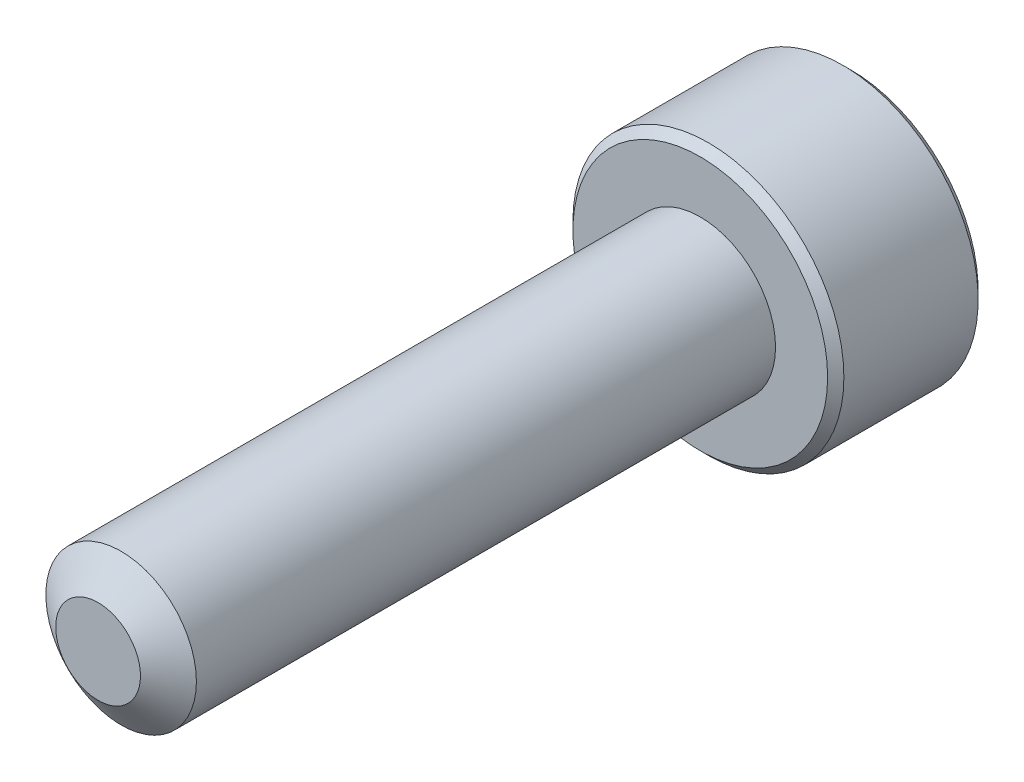
ISO-10303-21;
HEADER;
FILE_DESCRIPTION(('STEP AP214'),'2;1');
FILE_NAME('part.step','',(''),(''),'','','');
FILE_SCHEMA(('AUTOMOTIVE_DESIGN { 1 0 10303 214 1 1 1 1 }'));
ENDSEC;
DATA;
#1=APPLICATION_CONTEXT('core data for automotive mechanical design processes');
#2=APPLICATION_PROTOCOL_DEFINITION('international standard','automotive_design',2000,#1);
#3=PRODUCT_CONTEXT('',#1,'mechanical');
#4=PRODUCT('Part','Part','',(#3));
#5=PRODUCT_RELATED_PRODUCT_CATEGORY('part','',(#4));
#6=PRODUCT_DEFINITION_FORMATION('','',#4);
#7=PRODUCT_DEFINITION_CONTEXT('part definition',#1,'design');
#8=PRODUCT_DEFINITION('design','',#6,#7);
#9=PRODUCT_DEFINITION_SHAPE('','',#8);
#10=(LENGTH_UNIT() NAMED_UNIT(*) SI_UNIT(.MILLI.,.METRE.));
#11=(NAMED_UNIT(*) PLANE_ANGLE_UNIT() SI_UNIT($,.RADIAN.));
#12=(NAMED_UNIT(*) SI_UNIT($,.STERADIAN.) SOLID_ANGLE_UNIT());
#13=UNCERTAINTY_MEASURE_WITH_UNIT(LENGTH_MEASURE(1.E-05),#10,'distance_accuracy_value','');
#14=(GEOMETRIC_REPRESENTATION_CONTEXT(3) GLOBAL_UNCERTAINTY_ASSIGNED_CONTEXT((#13)) GLOBAL_UNIT_ASSIGNED_CONTEXT((#10,
#11,#12)) REPRESENTATION_CONTEXT('',''));
#15=CARTESIAN_POINT('',(0.,0.,0.));
#16=DIRECTION('',(0.,0.,1.));
#17=DIRECTION('',(1.,0.,0.));
#18=AXIS2_PLACEMENT_3D('',#15,#16,#17);
#19=CARTESIAN_POINT('',(-1.,0.577350269189626,-11.));
#20=DIRECTION('',(-0.5,0.866025403784439,0.));
#21=DIRECTION('',(0.,0.,1.));
#22=AXIS2_PLACEMENT_3D('',#19,#20,#21);
#23=PLANE('',#22);
#24=DIRECTION('',(0.,0.,-1.));
#25=VECTOR('',#24,1.);
#26=CARTESIAN_POINT('',(-1.,0.577350269189626,-11.));
#27=LINE('',#26,#25);
#28=CARTESIAN_POINT('',(-1.,0.577350269189626,-11.));
#29=VERTEX_POINT('',#28);
#30=CARTESIAN_POINT('',(-1.,0.577350269189625,-12.5));
#31=VERTEX_POINT('',#30);
#32=EDGE_CURVE('E11',#29,#31,#27,.T.);
#33=ORIENTED_EDGE('',*,*,#32,.T.);
#34=CARTESIAN_POINT('',(-0.999999999999949,0.577350269189655,-12.5));
#35=CARTESIAN_POINT('',(-0.5,0.866025403784439,-12.2113248654052));
#36=CARTESIAN_POINT('',(0.,1.15470053837922,-12.5));
#37=(BOUNDED_CURVE() B_SPLINE_CURVE(2,(#34,#35,#36),.UNSPECIFIED.,.F.,
.F.) B_SPLINE_CURVE_WITH_KNOTS((3,3),(-0.3218671551163,-0.124274873543865),
.UNSPECIFIED.) CURVE() GEOMETRIC_REPRESENTATION_ITEM() RATIONAL_B_SPLINE_CURVE((1.46410161513778,
1.69059892324148,1.46410161513778)) REPRESENTATION_ITEM(''));
#38=CARTESIAN_POINT('',(0.,1.15470053837925,-12.5));
#39=VERTEX_POINT('',#38);
#40=EDGE_CURVE('E184',#31,#39,#37,.T.);
#41=ORIENTED_EDGE('',*,*,#40,.T.);
#42=DIRECTION('',(0.,0.,-1.));
#43=VECTOR('',#42,1.);
#44=CARTESIAN_POINT('',(0.,1.15470053837925,-11.));
#45=LINE('',#44,#43);
#46=CARTESIAN_POINT('',(0.,1.15470053837925,-11.));
#47=VERTEX_POINT('',#46);
#48=EDGE_CURVE('E266',#47,#39,#45,.T.);
#49=ORIENTED_EDGE('',*,*,#48,.F.);
#50=DIRECTION('',(0.866025403784439,0.5,0.));
#51=VECTOR('',#50,1.);
#52=CARTESIAN_POINT('',(-1.,0.577350269189626,-11.));
#53=LINE('',#52,#51);
#54=EDGE_CURVE('E190',#29,#47,#53,.T.);
#55=ORIENTED_EDGE('',*,*,#54,.F.);
#56=EDGE_LOOP('',(#33,#41,#49,#55));
#57=FACE_BOUND('',#56,.T.);
#58=ADVANCED_FACE('F17',(#57),#23,.F.);
#59=CARTESIAN_POINT('',(-1.,-0.577350269189626,-11.));
#60=DIRECTION('',(-1.,0.,0.));
#61=DIRECTION('',(0.,0.,1.));
#62=AXIS2_PLACEMENT_3D('',#59,#60,#61);
#63=PLANE('',#62);
#64=DIRECTION('',(0.,0.,-1.));
#65=VECTOR('',#64,1.);
#66=CARTESIAN_POINT('',(-1.,-0.577350269189626,-11.));
#67=LINE('',#66,#65);
#68=CARTESIAN_POINT('',(-1.,-0.577350269189626,-11.));
#69=VERTEX_POINT('',#68);
#70=CARTESIAN_POINT('',(-1.,-0.577350269189626,-12.5));
#71=VERTEX_POINT('',#70);
#72=EDGE_CURVE('E28',#69,#71,#67,.T.);
#73=ORIENTED_EDGE('',*,*,#72,.T.);
#74=CARTESIAN_POINT('',(-1.,-0.577350269189569,-12.5));
#75=CARTESIAN_POINT('',(-1.,0.,-12.2113248654052));
#76=CARTESIAN_POINT('',(-1.,0.577350269189568,-12.5));
#77=(BOUNDED_CURVE() B_SPLINE_CURVE(2,(#74,#75,#76),.UNSPECIFIED.,.F.,
.F.) B_SPLINE_CURVE_WITH_KNOTS((3,3),(-0.3218671551163,-0.124274873543865),
.UNSPECIFIED.) CURVE() GEOMETRIC_REPRESENTATION_ITEM() RATIONAL_B_SPLINE_CURVE((1.46410161513778,
1.69059892324148,1.46410161513778)) REPRESENTATION_ITEM(''));
#78=EDGE_CURVE('E139',#71,#31,#77,.T.);
#79=ORIENTED_EDGE('',*,*,#78,.T.);
#80=ORIENTED_EDGE('',*,*,#32,.F.);
#81=DIRECTION('',(0.,1.,0.));
#82=VECTOR('',#81,1.);
#83=CARTESIAN_POINT('',(-1.,-0.577350269189626,-11.));
#84=LINE('',#83,#82);
#85=EDGE_CURVE('E524',#69,#29,#84,.T.);
#86=ORIENTED_EDGE('',*,*,#85,.F.);
#87=EDGE_LOOP('',(#73,#79,#80,#86));
#88=FACE_BOUND('',#87,.T.);
#89=ADVANCED_FACE('F301',(#88),#63,.F.);
#90=CARTESIAN_POINT('',(0.,-1.15470053837925,-11.));
#91=DIRECTION('',(-0.5,-0.866025403784439,0.));
#92=DIRECTION('',(-0.866025403784439,0.5,0.));
#93=AXIS2_PLACEMENT_3D('',#90,#91,#92);
#94=PLANE('',#93);
#95=DIRECTION('',(0.,0.,-1.));
#96=VECTOR('',#95,1.);
#97=CARTESIAN_POINT('',(0.,-1.15470053837925,-11.));
#98=LINE('',#97,#96);
#99=CARTESIAN_POINT('',(0.,-1.15470053837925,-11.));
#100=VERTEX_POINT('',#99);
#101=CARTESIAN_POINT('',(0.,-1.15470053837925,-12.5));
#102=VERTEX_POINT('',#101);
#103=EDGE_CURVE('E223',#100,#102,#98,.T.);
#104=ORIENTED_EDGE('',*,*,#103,.T.);
#105=CARTESIAN_POINT('',(0.,-1.15470053837922,-12.5));
#106=CARTESIAN_POINT('',(-0.499999999999999,-0.866025403784439,-12.2113248654052));
#107=CARTESIAN_POINT('',(-0.999999999999951,-0.577350269189654,-12.5));
#108=(BOUNDED_CURVE() B_SPLINE_CURVE(2,(#105,#106,#107),.UNSPECIFIED.,.F.,
.F.) B_SPLINE_CURVE_WITH_KNOTS((3,3),(-0.3218671551163,-0.124274873543865),
.UNSPECIFIED.) CURVE() GEOMETRIC_REPRESENTATION_ITEM() RATIONAL_B_SPLINE_CURVE((1.46410161513778,
1.69059892324148,1.46410161513778)) REPRESENTATION_ITEM(''));
#109=EDGE_CURVE('E191',#102,#71,#108,.T.);
#110=ORIENTED_EDGE('',*,*,#109,.T.);
#111=ORIENTED_EDGE('',*,*,#72,.F.);
#112=DIRECTION('',(-0.866025403784439,0.5,0.));
#113=VECTOR('',#112,1.);
#114=CARTESIAN_POINT('',(0.,-1.15470053837925,-11.));
#115=LINE('',#114,#113);
#116=EDGE_CURVE('E132',#100,#69,#115,.T.);
#117=ORIENTED_EDGE('',*,*,#116,.F.);
#118=EDGE_LOOP('',(#104,#110,#111,#117));
#119=FACE_BOUND('',#118,.T.);
#120=ADVANCED_FACE('F306',(#119),#94,.F.);
#121=CARTESIAN_POINT('',(1.,-0.577350269189626,-11.));
#122=DIRECTION('',(0.5,-0.866025403784439,0.));
#123=DIRECTION('',(0.,0.,-1.));
#124=AXIS2_PLACEMENT_3D('',#121,#122,#123);
#125=PLANE('',#124);
#126=DIRECTION('',(0.,0.,-1.));
#127=VECTOR('',#126,1.);
#128=CARTESIAN_POINT('',(1.,-0.577350269189626,-11.));
#129=LINE('',#128,#127);
#130=CARTESIAN_POINT('',(1.,-0.577350269189626,-11.));
#131=VERTEX_POINT('',#130);
#132=CARTESIAN_POINT('',(1.,-0.577350269189625,-12.5));
#133=VERTEX_POINT('',#132);
#134=EDGE_CURVE('E228',#131,#133,#129,.T.);
#135=ORIENTED_EDGE('',*,*,#134,.T.);
#136=CARTESIAN_POINT('',(0.999999999999949,-0.577350269189655,-12.5));
#137=CARTESIAN_POINT('',(0.5,-0.866025403784439,-12.2113248654052));
#138=CARTESIAN_POINT('',(0.,-1.15470053837922,-12.5));
#139=(BOUNDED_CURVE() B_SPLINE_CURVE(2,(#136,#137,#138),.UNSPECIFIED.,.F.,
.F.) B_SPLINE_CURVE_WITH_KNOTS((3,3),(-0.3218671551163,-0.124274873543865),
.UNSPECIFIED.) CURVE() GEOMETRIC_REPRESENTATION_ITEM() RATIONAL_B_SPLINE_CURVE((1.46410161513778,
1.69059892324148,1.46410161513778)) REPRESENTATION_ITEM(''));
#140=EDGE_CURVE('E170',#133,#102,#139,.T.);
#141=ORIENTED_EDGE('',*,*,#140,.T.);
#142=ORIENTED_EDGE('',*,*,#103,.F.);
#143=DIRECTION('',(-0.866025403784439,-0.5,0.));
#144=VECTOR('',#143,1.);
#145=CARTESIAN_POINT('',(1.,-0.577350269189626,-11.));
#146=LINE('',#145,#144);
#147=EDGE_CURVE('E157',#131,#100,#146,.T.);
#148=ORIENTED_EDGE('',*,*,#147,.F.);
#149=EDGE_LOOP('',(#135,#141,#142,#148));
#150=FACE_BOUND('',#149,.T.);
#151=ADVANCED_FACE('F358',(#150),#125,.F.);
#152=CARTESIAN_POINT('',(1.,0.577350269189626,-11.));
#153=DIRECTION('',(1.,0.,0.));
#154=DIRECTION('',(0.,1.,0.));
#155=AXIS2_PLACEMENT_3D('',#152,#153,#154);
#156=PLANE('',#155);
#157=DIRECTION('',(0.,0.,-1.));
#158=VECTOR('',#157,1.);
#159=CARTESIAN_POINT('',(1.,0.577350269189626,-11.));
#160=LINE('',#159,#158);
#161=CARTESIAN_POINT('',(1.,0.577350269189626,-11.));
#162=VERTEX_POINT('',#161);
#163=CARTESIAN_POINT('',(1.,0.577350269189626,-12.5));
#164=VERTEX_POINT('',#163);
#165=EDGE_CURVE('E21',#162,#164,#160,.T.);
#166=ORIENTED_EDGE('',*,*,#165,.T.);
#167=CARTESIAN_POINT('',(1.,0.57735026918957,-12.5));
#168=CARTESIAN_POINT('',(1.,0.,-12.2113248654052));
#169=CARTESIAN_POINT('',(1.,-0.577350269189567,-12.5));
#170=(BOUNDED_CURVE() B_SPLINE_CURVE(2,(#167,#168,#169),.UNSPECIFIED.,.F.,
.F.) B_SPLINE_CURVE_WITH_KNOTS((3,3),(-0.3218671551163,-0.124274873543866),
.UNSPECIFIED.) CURVE() GEOMETRIC_REPRESENTATION_ITEM() RATIONAL_B_SPLINE_CURVE((1.46410161513777,
1.69059892324148,1.46410161513777)) REPRESENTATION_ITEM(''));
#171=EDGE_CURVE('E164',#164,#133,#170,.T.);
#172=ORIENTED_EDGE('',*,*,#171,.T.);
#173=ORIENTED_EDGE('',*,*,#134,.F.);
#174=DIRECTION('',(0.,-1.,0.));
#175=VECTOR('',#174,1.);
#176=CARTESIAN_POINT('',(1.,0.577350269189626,-11.));
#177=LINE('',#176,#175);
#178=EDGE_CURVE('E161',#162,#131,#177,.T.);
#179=ORIENTED_EDGE('',*,*,#178,.F.);
#180=EDGE_LOOP('',(#166,#172,#173,#179));
#181=FACE_BOUND('',#180,.T.);
#182=ADVANCED_FACE('F366',(#181),#156,.F.);
#183=CARTESIAN_POINT('',(0.,1.15470053837925,-11.));
#184=DIRECTION('',(0.5,0.866025403784439,0.));
#185=DIRECTION('',(0.,0.,-1.));
#186=AXIS2_PLACEMENT_3D('',#183,#184,#185);
#187=PLANE('',#186);
#188=ORIENTED_EDGE('',*,*,#48,.T.);
#189=CARTESIAN_POINT('',(0.,1.15470053837923,-12.5));
#190=CARTESIAN_POINT('',(0.499999999999998,0.866025403784439,-12.2113248654052));
#191=CARTESIAN_POINT('',(0.999999999999949,0.577350269189655,-12.5));
#192=(BOUNDED_CURVE() B_SPLINE_CURVE(2,(#189,#190,#191),.UNSPECIFIED.,.F.,
.F.) B_SPLINE_CURVE_WITH_KNOTS((3,3),(-0.3218671551163,-0.124274873543865),
.UNSPECIFIED.) CURVE() GEOMETRIC_REPRESENTATION_ITEM() RATIONAL_B_SPLINE_CURVE((1.46410161513778,
1.69059892324148,1.46410161513778)) REPRESENTATION_ITEM(''));
#193=EDGE_CURVE('E171',#39,#164,#192,.T.);
#194=ORIENTED_EDGE('',*,*,#193,.T.);
#195=ORIENTED_EDGE('',*,*,#165,.F.);
#196=DIRECTION('',(0.866025403784439,-0.5,0.));
#197=VECTOR('',#196,1.);
#198=CARTESIAN_POINT('',(0.,1.15470053837925,-11.));
#199=LINE('',#198,#197);
#200=EDGE_CURVE('E221',#47,#162,#199,.T.);
#201=ORIENTED_EDGE('',*,*,#200,.F.);
#202=EDGE_LOOP('',(#188,#194,#195,#201));
#203=FACE_BOUND('',#202,.T.);
#204=ADVANCED_FACE('F263',(#203),#187,.F.);
#205=CARTESIAN_POINT('',(1.,1.73205080756888,-11.));
#206=DIRECTION('',(0.,0.,-1.));
#207=DIRECTION('',(0.,-1.,0.));
#208=AXIS2_PLACEMENT_3D('',#205,#206,#207);
#209=PLANE('',#208);
#210=ORIENTED_EDGE('',*,*,#54,.T.);
#211=ORIENTED_EDGE('',*,*,#200,.T.);
#212=ORIENTED_EDGE('',*,*,#178,.T.);
#213=ORIENTED_EDGE('',*,*,#147,.T.);
#214=ORIENTED_EDGE('',*,*,#116,.T.);
#215=ORIENTED_EDGE('',*,*,#85,.T.);
#216=EDGE_LOOP('',(#210,#211,#212,#213,#214,#215));
#217=FACE_BOUND('',#216,.T.);
#218=ADVANCED_FACE('F19',(#217),#209,.T.);
#219=CARTESIAN_POINT('',(0.,0.,-12.5));
#220=DIRECTION('',(0.,0.,-1.));
#221=DIRECTION('',(-1.,0.,0.));
#222=AXIS2_PLACEMENT_3D('',#219,#220,#221);
#223=CONICAL_SURFACE('',#222,1.15470053837925,0.78539816339745);
#224=CARTESIAN_POINT('',(0.,0.,-12.5));
#225=DIRECTION('',(0.,0.,-1.));
#226=DIRECTION('',(-1.,0.,0.));
#227=AXIS2_PLACEMENT_3D('',#224,#225,#226);
#228=CIRCLE('',#227,1.15470053837925);
#229=EDGE_CURVE('E112',#31,#39,#228,.T.);
#230=ORIENTED_EDGE('',*,*,#229,.T.);
#231=ORIENTED_EDGE('',*,*,#40,.F.);
#232=EDGE_LOOP('',(#230,#231));
#233=FACE_BOUND('',#232,.T.);
#234=ADVANCED_FACE('F285',(#233),#223,.F.);
#235=CARTESIAN_POINT('',(0.,0.,-12.5));
#236=DIRECTION('',(0.,0.,-1.));
#237=DIRECTION('',(-1.,0.,0.));
#238=AXIS2_PLACEMENT_3D('',#235,#236,#237);
#239=CONICAL_SURFACE('',#238,1.15470053837925,0.78539816339745);
#240=CARTESIAN_POINT('',(0.,0.,-12.5));
#241=DIRECTION('',(0.,0.,-1.));
#242=DIRECTION('',(-1.,0.,0.));
#243=AXIS2_PLACEMENT_3D('',#240,#241,#242);
#244=CIRCLE('',#243,1.15470053837925);
#245=EDGE_CURVE('E201',#102,#71,#244,.T.);
#246=ORIENTED_EDGE('',*,*,#245,.T.);
#247=ORIENTED_EDGE('',*,*,#109,.F.);
#248=EDGE_LOOP('',(#246,#247));
#249=FACE_BOUND('',#248,.T.);
#250=ADVANCED_FACE('F325',(#249),#239,.F.);
#251=CARTESIAN_POINT('',(0.,0.,-12.5));
#252=DIRECTION('',(0.,0.,-1.));
#253=DIRECTION('',(-1.,0.,0.));
#254=AXIS2_PLACEMENT_3D('',#251,#252,#253);
#255=CONICAL_SURFACE('',#254,1.15470053837925,0.78539816339745);
#256=CARTESIAN_POINT('',(0.,0.,-12.5));
#257=DIRECTION('',(0.,0.,-1.));
#258=DIRECTION('',(-1.,0.,0.));
#259=AXIS2_PLACEMENT_3D('',#256,#257,#258);
#260=CIRCLE('',#259,1.15470053837925);
#261=EDGE_CURVE('E202',#133,#102,#260,.T.);
#262=ORIENTED_EDGE('',*,*,#261,.T.);
#263=ORIENTED_EDGE('',*,*,#140,.F.);
#264=EDGE_LOOP('',(#262,#263));
#265=FACE_BOUND('',#264,.T.);
#266=ADVANCED_FACE('F330',(#265),#255,.F.);
#267=CARTESIAN_POINT('',(0.,0.,-12.5));
#268=DIRECTION('',(0.,0.,-1.));
#269=DIRECTION('',(1.,0.,0.));
#270=AXIS2_PLACEMENT_3D('',#267,#268,#269);
#271=CONICAL_SURFACE('',#270,1.15470053837925,0.78539816339745);
#272=CARTESIAN_POINT('',(0.,0.,-12.5));
#273=DIRECTION('',(0.,0.,-1.));
#274=DIRECTION('',(-1.,0.,0.));
#275=AXIS2_PLACEMENT_3D('',#272,#273,#274);
#276=CIRCLE('',#275,1.15470053837925);
#277=EDGE_CURVE('E183',#164,#133,#276,.T.);
#278=ORIENTED_EDGE('',*,*,#277,.T.);
#279=ORIENTED_EDGE('',*,*,#171,.F.);
#280=EDGE_LOOP('',(#278,#279));
#281=FACE_BOUND('',#280,.T.);
#282=ADVANCED_FACE('F388',(#281),#271,.F.);
#283=CARTESIAN_POINT('',(0.,0.,-12.5));
#284=DIRECTION('',(0.,0.,-1.));
#285=DIRECTION('',(-1.,0.,0.));
#286=AXIS2_PLACEMENT_3D('',#283,#284,#285);
#287=CONICAL_SURFACE('',#286,1.15470053837925,0.78539816339745);
#288=CARTESIAN_POINT('',(0.,0.,-12.5));
#289=DIRECTION('',(0.,0.,-1.));
#290=DIRECTION('',(-1.,0.,0.));
#291=AXIS2_PLACEMENT_3D('',#288,#289,#290);
#292=CIRCLE('',#291,1.15470053837925);
#293=EDGE_CURVE('E179',#39,#164,#292,.T.);
#294=ORIENTED_EDGE('',*,*,#293,.T.);
#295=ORIENTED_EDGE('',*,*,#193,.F.);
#296=EDGE_LOOP('',(#294,#295));
#297=FACE_BOUND('',#296,.T.);
#298=ADVANCED_FACE('F397',(#297),#287,.F.);
#299=CARTESIAN_POINT('',(0.,0.,-10.));
#300=DIRECTION('',(0.,0.,-1.));
#301=DIRECTION('',(0.,-1.,0.));
#302=AXIS2_PLACEMENT_3D('',#299,#300,#301);
#303=PLANE('',#302);
#304=CARTESIAN_POINT('',(0.,0.,-10.));
#305=DIRECTION('',(0.,0.,1.));
#306=DIRECTION('',(1.,0.,0.));
#307=AXIS2_PLACEMENT_3D('',#304,#305,#306);
#308=CIRCLE('',#307,1.25);
#309=CARTESIAN_POINT('',(1.25,0.,-10.));
#310=VERTEX_POINT('',#309);
#311=EDGE_CURVE('E110',#310,#310,#308,.T.);
#312=ORIENTED_EDGE('',*,*,#311,.F.);
#313=EDGE_LOOP('',(#312));
#314=FACE_BOUND('',#313,.T.);
#315=CARTESIAN_POINT('',(0.,0.,-10.));
#316=DIRECTION('',(0.,0.,1.));
#317=DIRECTION('',(-1.,0.,0.));
#318=AXIS2_PLACEMENT_3D('',#315,#316,#317);
#319=CIRCLE('',#318,2.115);
#320=CARTESIAN_POINT('',(2.115,0.,-10.));
#321=VERTEX_POINT('',#320);
#322=EDGE_CURVE('E134',#321,#321,#319,.T.);
#323=ORIENTED_EDGE('',*,*,#322,.T.);
#324=EDGE_LOOP('',(#323));
#325=FACE_BOUND('',#324,.T.);
#326=ADVANCED_FACE('F318',(#314,#325),#303,.F.);
#327=CARTESIAN_POINT('',(0.,0.,-12.5));
#328=DIRECTION('',(0.,0.,-1.));
#329=DIRECTION('',(0.,-1.,0.));
#330=AXIS2_PLACEMENT_3D('',#327,#328,#329);
#331=PLANE('',#330);
#332=ORIENTED_EDGE('',*,*,#229,.F.);
#333=CARTESIAN_POINT('',(0.,0.,-12.5));
#334=DIRECTION('',(0.,0.,-1.));
#335=DIRECTION('',(-1.,0.,0.));
#336=AXIS2_PLACEMENT_3D('',#333,#334,#335);
#337=CIRCLE('',#336,1.15470053837925);
#338=EDGE_CURVE('E145',#71,#31,#337,.T.);
#339=ORIENTED_EDGE('',*,*,#338,.F.);
#340=ORIENTED_EDGE('',*,*,#245,.F.);
#341=ORIENTED_EDGE('',*,*,#261,.F.);
#342=ORIENTED_EDGE('',*,*,#277,.F.);
#343=ORIENTED_EDGE('',*,*,#293,.F.);
#344=EDGE_LOOP('',(#332,#339,#340,#341,#342,#343));
#345=FACE_BOUND('',#344,.T.);
#346=CARTESIAN_POINT('',(0.,0.,-12.5));
#347=DIRECTION('',(0.,0.,-1.));
#348=DIRECTION('',(-1.,0.,0.));
#349=AXIS2_PLACEMENT_3D('',#346,#347,#348);
#350=CIRCLE('',#349,2.115);
#351=CARTESIAN_POINT('',(-2.115,0.,-12.5));
#352=VERTEX_POINT('',#351);
#353=EDGE_CURVE('E146',#352,#352,#350,.T.);
#354=ORIENTED_EDGE('',*,*,#353,.T.);
#355=EDGE_LOOP('',(#354));
#356=FACE_BOUND('',#355,.T.);
#357=ADVANCED_FACE('F312',(#345,#356),#331,.T.);
#358=CARTESIAN_POINT('',(0.,0.,0.));
#359=DIRECTION('',(0.,0.,1.));
#360=DIRECTION('',(1.,0.,0.));
#361=AXIS2_PLACEMENT_3D('',#358,#359,#360);
#362=PLANE('',#361);
#363=CARTESIAN_POINT('',(0.,0.,0.));
#364=DIRECTION('',(0.,0.,1.));
#365=DIRECTION('',(1.,0.,0.));
#366=AXIS2_PLACEMENT_3D('',#363,#364,#365);
#367=CIRCLE('',#366,0.70371642622275);
#368=CARTESIAN_POINT('',(0.70371642622275,0.,0.));
#369=VERTEX_POINT('',#368);
#370=EDGE_CURVE('E119',#369,#369,#367,.T.);
#371=ORIENTED_EDGE('',*,*,#370,.T.);
#372=EDGE_LOOP('',(#371));
#373=FACE_BOUND('',#372,.T.);
#374=ADVANCED_FACE('F317',(#373),#362,.T.);
#375=CARTESIAN_POINT('',(0.,0.,0.));
#376=DIRECTION('',(0.,0.,-1.));
#377=DIRECTION('',(-1.,0.,0.));
#378=AXIS2_PLACEMENT_3D('',#375,#376,#377);
#379=CYLINDRICAL_SURFACE('',#378,1.25);
#380=ORIENTED_EDGE('',*,*,#311,.T.);
#381=DIRECTION('',(0.,0.,1.));
#382=VECTOR('',#381,1.);
#383=CARTESIAN_POINT('',(1.25,0.,0.));
#384=LINE('',#383,#382);
#385=CARTESIAN_POINT('',(1.25,0.,-0.382511876358968));
#386=VERTEX_POINT('',#385);
#387=EDGE_CURVE('E104',#310,#386,#384,.T.);
#388=ORIENTED_EDGE('',*,*,#387,.T.);
#389=CARTESIAN_POINT('',(0.,0.,-0.382511876358968));
#390=DIRECTION('',(0.,0.,1.));
#391=DIRECTION('',(-1.,0.,0.));
#392=AXIS2_PLACEMENT_3D('',#389,#390,#391);
#393=CIRCLE('',#392,1.25);
#394=EDGE_CURVE('E108',#386,#386,#393,.T.);
#395=ORIENTED_EDGE('',*,*,#394,.F.);
#396=ORIENTED_EDGE('',*,*,#387,.F.);
#397=EDGE_LOOP('',(#380,#388,#395,#396));
#398=FACE_BOUND('',#397,.T.);
#399=ADVANCED_FACE('F106',(#398),#379,.T.);
#400=CARTESIAN_POINT('',(0.,0.,-12.5));
#401=DIRECTION('',(0.,0.,1.));
#402=DIRECTION('',(1.,0.,0.));
#403=AXIS2_PLACEMENT_3D('',#400,#401,#402);
#404=CYLINDRICAL_SURFACE('',#403,2.25);
#405=CARTESIAN_POINT('',(0.,0.,-10.135));
#406=DIRECTION('',(0.,0.,-1.));
#407=DIRECTION('',(-1.,0.,0.));
#408=AXIS2_PLACEMENT_3D('',#405,#406,#407);
#409=CIRCLE('',#408,2.25);
#410=CARTESIAN_POINT('',(-2.25,0.,-10.135));
#411=VERTEX_POINT('',#410);
#412=CARTESIAN_POINT('',(2.25,0.,-10.135));
#413=VERTEX_POINT('',#412);
#414=EDGE_CURVE('E127',#411,#413,#409,.T.);
#415=ORIENTED_EDGE('',*,*,#414,.T.);
#416=CARTESIAN_POINT('',(0.,0.,-10.135));
#417=DIRECTION('',(0.,0.,-1.));
#418=DIRECTION('',(-1.,0.,0.));
#419=AXIS2_PLACEMENT_3D('',#416,#417,#418);
#420=CIRCLE('',#419,2.25);
#421=EDGE_CURVE('E172',#413,#411,#420,.T.);
#422=ORIENTED_EDGE('',*,*,#421,.T.);
#423=DIRECTION('',(0.,0.,-1.));
#424=VECTOR('',#423,1.);
#425=CARTESIAN_POINT('',(-2.25,0.,-12.5));
#426=LINE('',#425,#424);
#427=CARTESIAN_POINT('',(-2.25,0.,-12.365));
#428=VERTEX_POINT('',#427);
#429=EDGE_CURVE('E156',#411,#428,#426,.T.);
#430=ORIENTED_EDGE('',*,*,#429,.T.);
#431=CARTESIAN_POINT('',(0.,0.,-12.365));
#432=DIRECTION('',(0.,0.,1.));
#433=DIRECTION('',(-1.,0.,0.));
#434=AXIS2_PLACEMENT_3D('',#431,#432,#433);
#435=CIRCLE('',#434,2.25);
#436=EDGE_CURVE('E137',#428,#428,#435,.T.);
#437=ORIENTED_EDGE('',*,*,#436,.T.);
#438=ORIENTED_EDGE('',*,*,#429,.F.);
#439=EDGE_LOOP('',(#415,#422,#430,#437,#438));
#440=FACE_BOUND('',#439,.T.);
#441=ADVANCED_FACE('F290',(#440),#404,.T.);
#442=CARTESIAN_POINT('',(0.,0.,-12.5));
#443=DIRECTION('',(0.,0.,-1.));
#444=DIRECTION('',(-1.,0.,0.));
#445=AXIS2_PLACEMENT_3D('',#442,#443,#444);
#446=CONICAL_SURFACE('',#445,1.15470053837925,0.78539816339745);
#447=ORIENTED_EDGE('',*,*,#78,.F.);
#448=ORIENTED_EDGE('',*,*,#338,.T.);
#449=EDGE_LOOP('',(#447,#448));
#450=FACE_BOUND('',#449,.T.);
#451=ADVANCED_FACE('F295',(#450),#446,.F.);
#452=CARTESIAN_POINT('',(0.,0.,-12.5));
#453=DIRECTION('',(0.,0.,1.));
#454=DIRECTION('',(1.,0.,0.));
#455=AXIS2_PLACEMENT_3D('',#452,#453,#454);
#456=CONICAL_SURFACE('',#455,2.115,0.785398163397453);
#457=ORIENTED_EDGE('',*,*,#436,.F.);
#458=DIRECTION('',(0.707106781186551,0.,-0.707106781186544));
#459=VECTOR('',#458,1.);
#460=CARTESIAN_POINT('',(-2.115,0.,-12.5));
#461=LINE('',#460,#459);
#462=EDGE_CURVE('E153',#428,#352,#461,.T.);
#463=ORIENTED_EDGE('',*,*,#462,.T.);
#464=ORIENTED_EDGE('',*,*,#353,.F.);
#465=ORIENTED_EDGE('',*,*,#462,.F.);
#466=EDGE_LOOP('',(#457,#463,#464,#465));
#467=FACE_BOUND('',#466,.T.);
#468=ADVANCED_FACE('F348',(#467),#456,.T.);
#469=CARTESIAN_POINT('',(0.,0.,-10.135));
#470=DIRECTION('',(0.,0.,-1.));
#471=DIRECTION('',(-1.,0.,0.));
#472=AXIS2_PLACEMENT_3D('',#469,#470,#471);
#473=CONICAL_SURFACE('',#472,2.25,0.785398163397447);
#474=ORIENTED_EDGE('',*,*,#414,.F.);
#475=ORIENTED_EDGE('',*,*,#421,.F.);
#476=DIRECTION('',(-0.707106781186546,0.,0.707106781186549));
#477=VECTOR('',#476,1.);
#478=CARTESIAN_POINT('',(2.25,0.,-10.135));
#479=LINE('',#478,#477);
#480=EDGE_CURVE('E138',#413,#321,#479,.T.);
#481=ORIENTED_EDGE('',*,*,#480,.T.);
#482=ORIENTED_EDGE('',*,*,#322,.F.);
#483=ORIENTED_EDGE('',*,*,#480,.F.);
#484=EDGE_LOOP('',(#474,#475,#481,#482,#483));
#485=FACE_BOUND('',#484,.T.);
#486=ADVANCED_FACE('F343',(#485),#473,.T.);
#487=CARTESIAN_POINT('',(0.,0.,0.));
#488=DIRECTION('',(0.,0.,-1.));
#489=DIRECTION('',(-1.,0.,0.));
#490=AXIS2_PLACEMENT_3D('',#487,#488,#489);
#491=CONICAL_SURFACE('',#490,0.70371642622275,0.959931088596884);
#492=ORIENTED_EDGE('',*,*,#394,.T.);
#493=DIRECTION('',(-0.819152044288993,0.,0.573576436351044));
#494=VECTOR('',#493,1.);
#495=CARTESIAN_POINT('',(0.70371642622275,0.,0.));
#496=LINE('',#495,#494);
#497=EDGE_CURVE('E117',#386,#369,#496,.T.);
#498=ORIENTED_EDGE('',*,*,#497,.T.);
#499=ORIENTED_EDGE('',*,*,#370,.F.);
#500=ORIENTED_EDGE('',*,*,#497,.F.);
#501=EDGE_LOOP('',(#492,#498,#499,#500));
#502=FACE_BOUND('',#501,.T.);
#503=ADVANCED_FACE('F118',(#502),#491,.T.);
#504=CLOSED_SHELL('',(#58,#89,#120,#151,#182,#204,#218,#234,#250,#266,#282,#298,#326,#357,#374,
#399,#441,#451,#468,#486,#503));
#505=MANIFOLD_SOLID_BREP('B1',#504);
#506=ADVANCED_BREP_SHAPE_REPRESENTATION('',(#18,#505),#14);
#507=SHAPE_DEFINITION_REPRESENTATION(#9,#506);
ENDSEC;
END-ISO-10303-21;
